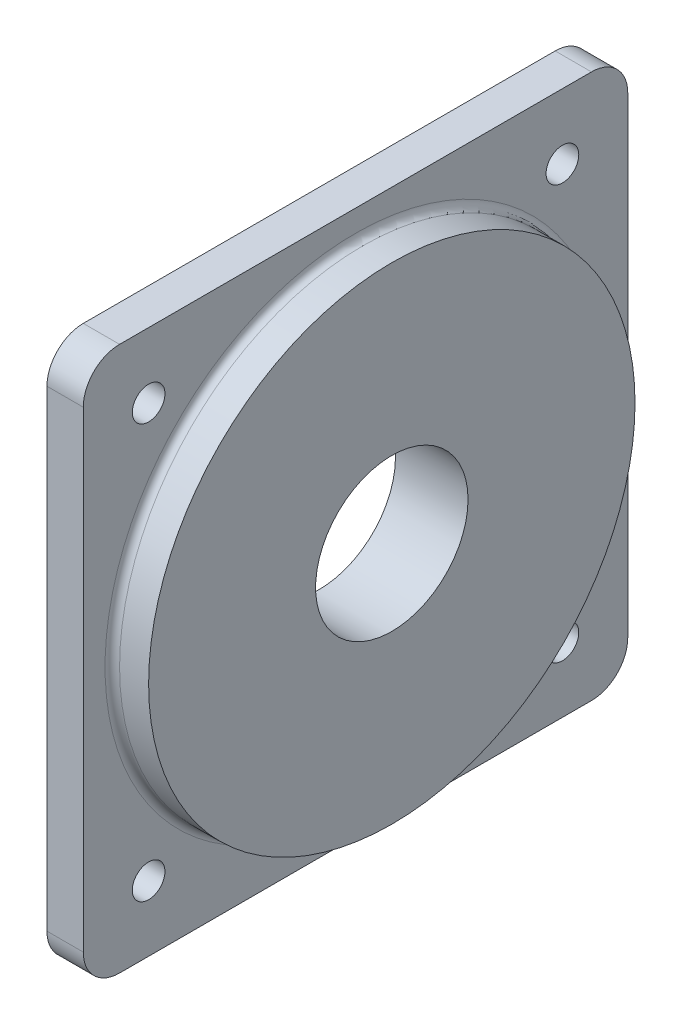
ISO-10303-21;
HEADER;
FILE_DESCRIPTION(('STEP AP214'),'2;1');
FILE_NAME('part.step','',(''),(''),'','','');
FILE_SCHEMA(('AUTOMOTIVE_DESIGN { 1 0 10303 214 1 1 1 1 }'));
ENDSEC;
DATA;
#1=APPLICATION_CONTEXT('core data for automotive mechanical design processes');
#2=APPLICATION_PROTOCOL_DEFINITION('international standard','automotive_design',2000,#1);
#3=PRODUCT_CONTEXT('',#1,'mechanical');
#4=PRODUCT('Part','Part','',(#3));
#5=PRODUCT_RELATED_PRODUCT_CATEGORY('part','',(#4));
#6=PRODUCT_DEFINITION_FORMATION('','',#4);
#7=PRODUCT_DEFINITION_CONTEXT('part definition',#1,'design');
#8=PRODUCT_DEFINITION('design','',#6,#7);
#9=PRODUCT_DEFINITION_SHAPE('','',#8);
#10=(LENGTH_UNIT() NAMED_UNIT(*) SI_UNIT(.MILLI.,.METRE.));
#11=(NAMED_UNIT(*) PLANE_ANGLE_UNIT() SI_UNIT($,.RADIAN.));
#12=(NAMED_UNIT(*) SI_UNIT($,.STERADIAN.) SOLID_ANGLE_UNIT());
#13=UNCERTAINTY_MEASURE_WITH_UNIT(LENGTH_MEASURE(1.E-05),#10,'distance_accuracy_value','');
#14=(GEOMETRIC_REPRESENTATION_CONTEXT(3) GLOBAL_UNCERTAINTY_ASSIGNED_CONTEXT((#13)) GLOBAL_UNIT_ASSIGNED_CONTEXT((#10,
#11,#12)) REPRESENTATION_CONTEXT('',''));
#15=CARTESIAN_POINT('',(0.,0.,0.));
#16=DIRECTION('',(0.,0.,1.));
#17=DIRECTION('',(1.,0.,0.));
#18=AXIS2_PLACEMENT_3D('',#15,#16,#17);
#19=CARTESIAN_POINT('',(10.,75.,-75.));
#20=DIRECTION('',(0.,0.,1.));
#21=DIRECTION('',(1.,0.,0.));
#22=AXIS2_PLACEMENT_3D('',#19,#20,#21);
#23=PLANE('',#22);
#24=DIRECTION('',(0.,1.,0.));
#25=VECTOR('',#24,1.);
#26=CARTESIAN_POINT('',(10.,75.,-75.));
#27=LINE('',#26,#25);
#28=CARTESIAN_POINT('',(10.,-65.,-75.));
#29=VERTEX_POINT('',#28);
#30=CARTESIAN_POINT('',(10.,65.,-75.));
#31=VERTEX_POINT('',#30);
#32=EDGE_CURVE('E132',#29,#31,#27,.T.);
#33=ORIENTED_EDGE('',*,*,#32,.F.);
#34=DIRECTION('',(-1.,0.,0.));
#35=VECTOR('',#34,1.);
#36=CARTESIAN_POINT('',(10.,-65.,-75.));
#37=LINE('',#36,#35);
#38=CARTESIAN_POINT('',(0.,-65.,-75.));
#39=VERTEX_POINT('',#38);
#40=EDGE_CURVE('E158',#29,#39,#37,.T.);
#41=ORIENTED_EDGE('',*,*,#40,.T.);
#42=DIRECTION('',(0.,1.,0.));
#43=VECTOR('',#42,1.);
#44=CARTESIAN_POINT('',(0.,75.,-75.));
#45=LINE('',#44,#43);
#46=CARTESIAN_POINT('',(0.,65.,-75.));
#47=VERTEX_POINT('',#46);
#48=EDGE_CURVE('E211',#39,#47,#45,.T.);
#49=ORIENTED_EDGE('',*,*,#48,.T.);
#50=DIRECTION('',(-1.,0.,0.));
#51=VECTOR('',#50,1.);
#52=CARTESIAN_POINT('',(10.,65.,-75.));
#53=LINE('',#52,#51);
#54=EDGE_CURVE('E156',#47,#31,#53,.F.);
#55=ORIENTED_EDGE('',*,*,#54,.T.);
#56=EDGE_LOOP('',(#33,#41,#49,#55));
#57=FACE_BOUND('',#56,.T.);
#58=ADVANCED_FACE('F39',(#57),#23,.F.);
#59=CARTESIAN_POINT('',(10.,75.,75.));
#60=DIRECTION('',(0.,-1.,0.));
#61=DIRECTION('',(0.,0.,-1.));
#62=AXIS2_PLACEMENT_3D('',#59,#60,#61);
#63=PLANE('',#62);
#64=DIRECTION('',(0.,0.,1.));
#65=VECTOR('',#64,1.);
#66=CARTESIAN_POINT('',(10.,75.,75.));
#67=LINE('',#66,#65);
#68=CARTESIAN_POINT('',(10.,75.,-65.));
#69=VERTEX_POINT('',#68);
#70=CARTESIAN_POINT('',(10.,75.,65.));
#71=VERTEX_POINT('',#70);
#72=EDGE_CURVE('E135',#69,#71,#67,.T.);
#73=ORIENTED_EDGE('',*,*,#72,.F.);
#74=DIRECTION('',(-1.,0.,0.));
#75=VECTOR('',#74,1.);
#76=CARTESIAN_POINT('',(10.,75.,-65.));
#77=LINE('',#76,#75);
#78=CARTESIAN_POINT('',(0.,75.,-65.));
#79=VERTEX_POINT('',#78);
#80=EDGE_CURVE('E162',#69,#79,#77,.T.);
#81=ORIENTED_EDGE('',*,*,#80,.T.);
#82=DIRECTION('',(0.,0.,1.));
#83=VECTOR('',#82,1.);
#84=CARTESIAN_POINT('',(0.,75.,75.));
#85=LINE('',#84,#83);
#86=CARTESIAN_POINT('',(0.,75.,65.));
#87=VERTEX_POINT('',#86);
#88=EDGE_CURVE('E137',#79,#87,#85,.T.);
#89=ORIENTED_EDGE('',*,*,#88,.T.);
#90=DIRECTION('',(-1.,0.,0.));
#91=VECTOR('',#90,1.);
#92=CARTESIAN_POINT('',(10.,75.,65.));
#93=LINE('',#92,#91);
#94=EDGE_CURVE('E54',#87,#71,#93,.F.);
#95=ORIENTED_EDGE('',*,*,#94,.T.);
#96=EDGE_LOOP('',(#73,#81,#89,#95));
#97=FACE_BOUND('',#96,.T.);
#98=ADVANCED_FACE('F185',(#97),#63,.F.);
#99=CARTESIAN_POINT('',(10.,75.,75.));
#100=DIRECTION('',(0.,0.,-1.));
#101=DIRECTION('',(-1.,0.,0.));
#102=AXIS2_PLACEMENT_3D('',#99,#100,#101);
#103=PLANE('',#102);
#104=DIRECTION('',(0.,-1.,0.));
#105=VECTOR('',#104,1.);
#106=CARTESIAN_POINT('',(0.,75.,75.));
#107=LINE('',#106,#105);
#108=CARTESIAN_POINT('',(0.,65.,75.));
#109=VERTEX_POINT('',#108);
#110=CARTESIAN_POINT('',(0.,-65.,75.));
#111=VERTEX_POINT('',#110);
#112=EDGE_CURVE('E133',#109,#111,#107,.T.);
#113=ORIENTED_EDGE('',*,*,#112,.T.);
#114=DIRECTION('',(-1.,0.,0.));
#115=VECTOR('',#114,1.);
#116=CARTESIAN_POINT('',(10.,-65.,75.));
#117=LINE('',#116,#115);
#118=CARTESIAN_POINT('',(10.,-65.,75.));
#119=VERTEX_POINT('',#118);
#120=EDGE_CURVE('E111',#111,#119,#117,.F.);
#121=ORIENTED_EDGE('',*,*,#120,.T.);
#122=DIRECTION('',(0.,-1.,0.));
#123=VECTOR('',#122,1.);
#124=CARTESIAN_POINT('',(10.,75.,75.));
#125=LINE('',#124,#123);
#126=CARTESIAN_POINT('',(10.,65.,75.));
#127=VERTEX_POINT('',#126);
#128=EDGE_CURVE('E216',#127,#119,#125,.T.);
#129=ORIENTED_EDGE('',*,*,#128,.F.);
#130=DIRECTION('',(-1.,0.,0.));
#131=VECTOR('',#130,1.);
#132=CARTESIAN_POINT('',(10.,65.,75.));
#133=LINE('',#132,#131);
#134=EDGE_CURVE('E116',#127,#109,#133,.T.);
#135=ORIENTED_EDGE('',*,*,#134,.T.);
#136=EDGE_LOOP('',(#113,#121,#129,#135));
#137=FACE_BOUND('',#136,.T.);
#138=ADVANCED_FACE('F191',(#137),#103,.F.);
#139=CARTESIAN_POINT('',(10.,-75.,75.));
#140=DIRECTION('',(0.,1.,0.));
#141=DIRECTION('',(0.,0.,1.));
#142=AXIS2_PLACEMENT_3D('',#139,#140,#141);
#143=PLANE('',#142);
#144=DIRECTION('',(0.,0.,-1.));
#145=VECTOR('',#144,1.);
#146=CARTESIAN_POINT('',(10.,-75.,75.));
#147=LINE('',#146,#145);
#148=CARTESIAN_POINT('',(10.,-75.,65.));
#149=VERTEX_POINT('',#148);
#150=CARTESIAN_POINT('',(10.,-75.,-65.));
#151=VERTEX_POINT('',#150);
#152=EDGE_CURVE('E126',#149,#151,#147,.T.);
#153=ORIENTED_EDGE('',*,*,#152,.F.);
#154=DIRECTION('',(-1.,0.,0.));
#155=VECTOR('',#154,1.);
#156=CARTESIAN_POINT('',(10.,-75.,65.));
#157=LINE('',#156,#155);
#158=CARTESIAN_POINT('',(0.,-75.,65.));
#159=VERTEX_POINT('',#158);
#160=EDGE_CURVE('E110',#149,#159,#157,.T.);
#161=ORIENTED_EDGE('',*,*,#160,.T.);
#162=DIRECTION('',(0.,0.,-1.));
#163=VECTOR('',#162,1.);
#164=CARTESIAN_POINT('',(0.,-75.,75.));
#165=LINE('',#164,#163);
#166=CARTESIAN_POINT('',(0.,-75.,-65.));
#167=VERTEX_POINT('',#166);
#168=EDGE_CURVE('E123',#159,#167,#165,.T.);
#169=ORIENTED_EDGE('',*,*,#168,.T.);
#170=DIRECTION('',(-1.,0.,0.));
#171=VECTOR('',#170,1.);
#172=CARTESIAN_POINT('',(10.,-75.,-65.));
#173=LINE('',#172,#171);
#174=EDGE_CURVE('E128',#167,#151,#173,.F.);
#175=ORIENTED_EDGE('',*,*,#174,.T.);
#176=EDGE_LOOP('',(#153,#161,#169,#175));
#177=FACE_BOUND('',#176,.T.);
#178=ADVANCED_FACE('F122',(#177),#143,.F.);
#179=CARTESIAN_POINT('',(10.,0.,0.));
#180=DIRECTION('',(1.,0.,0.));
#181=DIRECTION('',(0.,0.,-1.));
#182=AXIS2_PLACEMENT_3D('',#179,#180,#181);
#183=PLANE('',#182);
#184=CARTESIAN_POINT('',(10.,-57.,-57.));
#185=DIRECTION('',(1.,0.,0.));
#186=DIRECTION('',(0.,0.,-1.));
#187=AXIS2_PLACEMENT_3D('',#184,#185,#186);
#188=CIRCLE('',#187,4.49999999999999);
#189=CARTESIAN_POINT('',(10.,-57.,-61.5));
#190=VERTEX_POINT('',#189);
#191=EDGE_CURVE('E249',#190,#190,#188,.T.);
#192=ORIENTED_EDGE('',*,*,#191,.F.);
#193=EDGE_LOOP('',(#192));
#194=FACE_BOUND('',#193,.T.);
#195=CARTESIAN_POINT('',(10.,-57.,57.));
#196=DIRECTION('',(1.,0.,0.));
#197=DIRECTION('',(0.,0.,-1.));
#198=AXIS2_PLACEMENT_3D('',#195,#196,#197);
#199=CIRCLE('',#198,4.49999999999999);
#200=CARTESIAN_POINT('',(10.,-57.,52.5));
#201=VERTEX_POINT('',#200);
#202=EDGE_CURVE('E243',#201,#201,#199,.T.);
#203=ORIENTED_EDGE('',*,*,#202,.F.);
#204=EDGE_LOOP('',(#203));
#205=FACE_BOUND('',#204,.T.);
#206=CARTESIAN_POINT('',(10.,57.,57.));
#207=DIRECTION('',(1.,0.,0.));
#208=DIRECTION('',(0.,0.,-1.));
#209=AXIS2_PLACEMENT_3D('',#206,#207,#208);
#210=CIRCLE('',#209,4.49999999999999);
#211=CARTESIAN_POINT('',(10.,57.,52.5));
#212=VERTEX_POINT('',#211);
#213=EDGE_CURVE('E237',#212,#212,#210,.T.);
#214=ORIENTED_EDGE('',*,*,#213,.F.);
#215=EDGE_LOOP('',(#214));
#216=FACE_BOUND('',#215,.T.);
#217=CARTESIAN_POINT('',(10.,57.,-57.));
#218=DIRECTION('',(1.,0.,0.));
#219=DIRECTION('',(0.,0.,-1.));
#220=AXIS2_PLACEMENT_3D('',#217,#218,#219);
#221=CIRCLE('',#220,4.49999999999999);
#222=CARTESIAN_POINT('',(10.,57.,-61.5));
#223=VERTEX_POINT('',#222);
#224=EDGE_CURVE('E231',#223,#223,#221,.T.);
#225=ORIENTED_EDGE('',*,*,#224,.F.);
#226=EDGE_LOOP('',(#225));
#227=FACE_BOUND('',#226,.T.);
#228=CARTESIAN_POINT('',(10.,0.,0.));
#229=DIRECTION('',(1.,0.,0.));
#230=DIRECTION('',(0.,0.,-1.));
#231=AXIS2_PLACEMENT_3D('',#228,#229,#230);
#232=CIRCLE('',#231,69.);
#233=CARTESIAN_POINT('',(10.,0.,-69.));
#234=VERTEX_POINT('',#233);
#235=EDGE_CURVE('E11',#234,#234,#232,.F.);
#236=ORIENTED_EDGE('',*,*,#235,.T.);
#237=EDGE_LOOP('',(#236));
#238=FACE_BOUND('',#237,.T.);
#239=ORIENTED_EDGE('',*,*,#128,.T.);
#240=CARTESIAN_POINT('',(10.,-65.,65.));
#241=DIRECTION('',(1.,0.,0.));
#242=DIRECTION('',(0.,0.,-1.));
#243=AXIS2_PLACEMENT_3D('',#240,#241,#242);
#244=CIRCLE('',#243,10.);
#245=EDGE_CURVE('E154',#119,#149,#244,.T.);
#246=ORIENTED_EDGE('',*,*,#245,.T.);
#247=ORIENTED_EDGE('',*,*,#152,.T.);
#248=CARTESIAN_POINT('',(10.,-65.,-65.));
#249=DIRECTION('',(1.,0.,0.));
#250=DIRECTION('',(0.,0.,-1.));
#251=AXIS2_PLACEMENT_3D('',#248,#249,#250);
#252=CIRCLE('',#251,10.);
#253=EDGE_CURVE('E152',#151,#29,#252,.T.);
#254=ORIENTED_EDGE('',*,*,#253,.T.);
#255=ORIENTED_EDGE('',*,*,#32,.T.);
#256=CARTESIAN_POINT('',(10.,65.,-65.));
#257=DIRECTION('',(1.,0.,0.));
#258=DIRECTION('',(0.,0.,-1.));
#259=AXIS2_PLACEMENT_3D('',#256,#257,#258);
#260=CIRCLE('',#259,10.);
#261=EDGE_CURVE('E61',#31,#69,#260,.T.);
#262=ORIENTED_EDGE('',*,*,#261,.T.);
#263=ORIENTED_EDGE('',*,*,#72,.T.);
#264=CARTESIAN_POINT('',(10.,65.,65.));
#265=DIRECTION('',(1.,0.,0.));
#266=DIRECTION('',(0.,0.,-1.));
#267=AXIS2_PLACEMENT_3D('',#264,#265,#266);
#268=CIRCLE('',#267,10.);
#269=EDGE_CURVE('E149',#71,#127,#268,.T.);
#270=ORIENTED_EDGE('',*,*,#269,.T.);
#271=EDGE_LOOP('',(#239,#246,#247,#254,#255,#262,#263,#270));
#272=FACE_BOUND('',#271,.T.);
#273=ADVANCED_FACE('F255',(#194,#205,#216,#227,#238,#272),#183,.T.);
#274=CARTESIAN_POINT('',(0.,0.,0.));
#275=DIRECTION('',(1.,0.,0.));
#276=DIRECTION('',(0.,0.,-1.));
#277=AXIS2_PLACEMENT_3D('',#274,#275,#276);
#278=PLANE('',#277);
#279=CARTESIAN_POINT('',(0.,-57.,-57.));
#280=DIRECTION('',(1.,0.,0.));
#281=DIRECTION('',(0.,0.,-1.));
#282=AXIS2_PLACEMENT_3D('',#279,#280,#281);
#283=CIRCLE('',#282,4.49999999999999);
#284=CARTESIAN_POINT('',(0.,-57.,-61.5));
#285=VERTEX_POINT('',#284);
#286=EDGE_CURVE('E246',#285,#285,#283,.T.);
#287=ORIENTED_EDGE('',*,*,#286,.T.);
#288=EDGE_LOOP('',(#287));
#289=FACE_BOUND('',#288,.T.);
#290=CARTESIAN_POINT('',(0.,-57.,57.));
#291=DIRECTION('',(1.,0.,0.));
#292=DIRECTION('',(0.,0.,-1.));
#293=AXIS2_PLACEMENT_3D('',#290,#291,#292);
#294=CIRCLE('',#293,4.49999999999999);
#295=CARTESIAN_POINT('',(0.,-57.,52.5));
#296=VERTEX_POINT('',#295);
#297=EDGE_CURVE('E240',#296,#296,#294,.T.);
#298=ORIENTED_EDGE('',*,*,#297,.T.);
#299=EDGE_LOOP('',(#298));
#300=FACE_BOUND('',#299,.T.);
#301=CARTESIAN_POINT('',(0.,57.,57.));
#302=DIRECTION('',(1.,0.,0.));
#303=DIRECTION('',(0.,0.,-1.));
#304=AXIS2_PLACEMENT_3D('',#301,#302,#303);
#305=CIRCLE('',#304,4.49999999999999);
#306=CARTESIAN_POINT('',(0.,57.,52.5));
#307=VERTEX_POINT('',#306);
#308=EDGE_CURVE('E234',#307,#307,#305,.T.);
#309=ORIENTED_EDGE('',*,*,#308,.T.);
#310=EDGE_LOOP('',(#309));
#311=FACE_BOUND('',#310,.T.);
#312=CARTESIAN_POINT('',(0.,57.,-57.));
#313=DIRECTION('',(1.,0.,0.));
#314=DIRECTION('',(0.,0.,-1.));
#315=AXIS2_PLACEMENT_3D('',#312,#313,#314);
#316=CIRCLE('',#315,4.49999999999999);
#317=CARTESIAN_POINT('',(0.,57.,-61.5));
#318=VERTEX_POINT('',#317);
#319=EDGE_CURVE('E226',#318,#318,#316,.T.);
#320=ORIENTED_EDGE('',*,*,#319,.T.);
#321=EDGE_LOOP('',(#320));
#322=FACE_BOUND('',#321,.T.);
#323=CARTESIAN_POINT('',(0.,0.,0.));
#324=DIRECTION('',(1.,0.,0.));
#325=DIRECTION('',(0.,0.,-1.));
#326=AXIS2_PLACEMENT_3D('',#323,#324,#325);
#327=CIRCLE('',#326,21.);
#328=CARTESIAN_POINT('',(0.,0.,-21.));
#329=VERTEX_POINT('',#328);
#330=EDGE_CURVE('E222',#329,#329,#327,.T.);
#331=ORIENTED_EDGE('',*,*,#330,.T.);
#332=EDGE_LOOP('',(#331));
#333=FACE_BOUND('',#332,.T.);
#334=ORIENTED_EDGE('',*,*,#168,.F.);
#335=CARTESIAN_POINT('',(0.,-65.,65.));
#336=DIRECTION('',(1.,0.,0.));
#337=DIRECTION('',(0.,0.,-1.));
#338=AXIS2_PLACEMENT_3D('',#335,#336,#337);
#339=CIRCLE('',#338,10.);
#340=EDGE_CURVE('E106',#159,#111,#339,.F.);
#341=ORIENTED_EDGE('',*,*,#340,.T.);
#342=ORIENTED_EDGE('',*,*,#112,.F.);
#343=CARTESIAN_POINT('',(0.,65.,65.));
#344=DIRECTION('',(1.,0.,0.));
#345=DIRECTION('',(0.,0.,-1.));
#346=AXIS2_PLACEMENT_3D('',#343,#344,#345);
#347=CIRCLE('',#346,10.);
#348=EDGE_CURVE('E127',#109,#87,#347,.F.);
#349=ORIENTED_EDGE('',*,*,#348,.T.);
#350=ORIENTED_EDGE('',*,*,#88,.F.);
#351=CARTESIAN_POINT('',(0.,65.,-65.));
#352=DIRECTION('',(1.,0.,0.));
#353=DIRECTION('',(0.,0.,-1.));
#354=AXIS2_PLACEMENT_3D('',#351,#352,#353);
#355=CIRCLE('',#354,10.);
#356=EDGE_CURVE('E143',#79,#47,#355,.F.);
#357=ORIENTED_EDGE('',*,*,#356,.T.);
#358=ORIENTED_EDGE('',*,*,#48,.F.);
#359=CARTESIAN_POINT('',(0.,-65.,-65.));
#360=DIRECTION('',(1.,0.,0.));
#361=DIRECTION('',(0.,0.,-1.));
#362=AXIS2_PLACEMENT_3D('',#359,#360,#361);
#363=CIRCLE('',#362,10.);
#364=EDGE_CURVE('E117',#39,#167,#363,.F.);
#365=ORIENTED_EDGE('',*,*,#364,.T.);
#366=EDGE_LOOP('',(#334,#341,#342,#349,#350,#357,#358,#365));
#367=FACE_BOUND('',#366,.T.);
#368=ADVANCED_FACE('F130',(#289,#300,#311,#322,#333,#367),#278,.F.);
#369=CARTESIAN_POINT('',(20.,0.,0.));
#370=DIRECTION('',(-1.,0.,0.));
#371=DIRECTION('',(0.,0.,1.));
#372=AXIS2_PLACEMENT_3D('',#369,#370,#371);
#373=CYLINDRICAL_SURFACE('',#372,67.);
#374=CARTESIAN_POINT('',(12.,0.,0.));
#375=DIRECTION('',(1.,0.,0.));
#376=DIRECTION('',(0.,0.,-1.));
#377=AXIS2_PLACEMENT_3D('',#374,#375,#376);
#378=CIRCLE('',#377,67.);
#379=CARTESIAN_POINT('',(12.,0.,-67.));
#380=VERTEX_POINT('',#379);
#381=EDGE_CURVE('E47',#380,#380,#378,.T.);
#382=ORIENTED_EDGE('',*,*,#381,.T.);
#383=EDGE_LOOP('',(#382));
#384=FACE_BOUND('',#383,.T.);
#385=CARTESIAN_POINT('',(20.,0.,0.));
#386=DIRECTION('',(1.,0.,0.));
#387=DIRECTION('',(0.,0.,-1.));
#388=AXIS2_PLACEMENT_3D('',#385,#386,#387);
#389=CIRCLE('',#388,67.);
#390=CARTESIAN_POINT('',(20.,0.,-67.));
#391=VERTEX_POINT('',#390);
#392=EDGE_CURVE('E212',#391,#391,#389,.T.);
#393=ORIENTED_EDGE('',*,*,#392,.F.);
#394=EDGE_LOOP('',(#393));
#395=FACE_BOUND('',#394,.T.);
#396=ADVANCED_FACE('F167',(#384,#395),#373,.T.);
#397=CARTESIAN_POINT('',(20.,0.,0.));
#398=DIRECTION('',(1.,0.,0.));
#399=DIRECTION('',(0.,0.,-1.));
#400=AXIS2_PLACEMENT_3D('',#397,#398,#399);
#401=PLANE('',#400);
#402=CARTESIAN_POINT('',(20.,0.,0.));
#403=DIRECTION('',(1.,0.,0.));
#404=DIRECTION('',(0.,0.,-1.));
#405=AXIS2_PLACEMENT_3D('',#402,#403,#404);
#406=CIRCLE('',#405,21.);
#407=CARTESIAN_POINT('',(20.,0.,-21.));
#408=VERTEX_POINT('',#407);
#409=EDGE_CURVE('E223',#408,#408,#406,.T.);
#410=ORIENTED_EDGE('',*,*,#409,.F.);
#411=EDGE_LOOP('',(#410));
#412=FACE_BOUND('',#411,.T.);
#413=ORIENTED_EDGE('',*,*,#392,.T.);
#414=EDGE_LOOP('',(#413));
#415=FACE_BOUND('',#414,.T.);
#416=ADVANCED_FACE('F199',(#412,#415),#401,.T.);
#417=CARTESIAN_POINT('',(10.,-65.,65.));
#418=DIRECTION('',(-1.,0.,0.));
#419=DIRECTION('',(0.,0.,1.));
#420=AXIS2_PLACEMENT_3D('',#417,#418,#419);
#421=CYLINDRICAL_SURFACE('',#420,10.);
#422=ORIENTED_EDGE('',*,*,#245,.F.);
#423=ORIENTED_EDGE('',*,*,#120,.F.);
#424=ORIENTED_EDGE('',*,*,#340,.F.);
#425=ORIENTED_EDGE('',*,*,#160,.F.);
#426=EDGE_LOOP('',(#422,#423,#424,#425));
#427=FACE_BOUND('',#426,.T.);
#428=ADVANCED_FACE('F109',(#427),#421,.T.);
#429=CARTESIAN_POINT('',(10.,-65.,-65.));
#430=DIRECTION('',(-1.,0.,0.));
#431=DIRECTION('',(0.,0.,1.));
#432=AXIS2_PLACEMENT_3D('',#429,#430,#431);
#433=CYLINDRICAL_SURFACE('',#432,10.);
#434=ORIENTED_EDGE('',*,*,#253,.F.);
#435=ORIENTED_EDGE('',*,*,#174,.F.);
#436=ORIENTED_EDGE('',*,*,#364,.F.);
#437=ORIENTED_EDGE('',*,*,#40,.F.);
#438=EDGE_LOOP('',(#434,#435,#436,#437));
#439=FACE_BOUND('',#438,.T.);
#440=ADVANCED_FACE('F198',(#439),#433,.T.);
#441=CARTESIAN_POINT('',(10.,65.,-65.));
#442=DIRECTION('',(-1.,0.,0.));
#443=DIRECTION('',(0.,0.,1.));
#444=AXIS2_PLACEMENT_3D('',#441,#442,#443);
#445=CYLINDRICAL_SURFACE('',#444,10.);
#446=ORIENTED_EDGE('',*,*,#261,.F.);
#447=ORIENTED_EDGE('',*,*,#54,.F.);
#448=ORIENTED_EDGE('',*,*,#356,.F.);
#449=ORIENTED_EDGE('',*,*,#80,.F.);
#450=EDGE_LOOP('',(#446,#447,#448,#449));
#451=FACE_BOUND('',#450,.T.);
#452=ADVANCED_FACE('F181',(#451),#445,.T.);
#453=CARTESIAN_POINT('',(10.,65.,65.));
#454=DIRECTION('',(-1.,0.,0.));
#455=DIRECTION('',(0.,0.,1.));
#456=AXIS2_PLACEMENT_3D('',#453,#454,#455);
#457=CYLINDRICAL_SURFACE('',#456,10.);
#458=ORIENTED_EDGE('',*,*,#269,.F.);
#459=ORIENTED_EDGE('',*,*,#94,.F.);
#460=ORIENTED_EDGE('',*,*,#348,.F.);
#461=ORIENTED_EDGE('',*,*,#134,.F.);
#462=EDGE_LOOP('',(#458,#459,#460,#461));
#463=FACE_BOUND('',#462,.T.);
#464=ADVANCED_FACE('F172',(#463),#457,.T.);
#465=CARTESIAN_POINT('',(12.,0.,0.));
#466=DIRECTION('',(1.,0.,0.));
#467=DIRECTION('',(0.,0.,-1.));
#468=AXIS2_PLACEMENT_3D('',#465,#466,#467);
#469=TOROIDAL_SURFACE('',#468,69.,2.);
#470=ORIENTED_EDGE('',*,*,#235,.F.);
#471=EDGE_LOOP('',(#470));
#472=FACE_BOUND('',#471,.T.);
#473=ORIENTED_EDGE('',*,*,#381,.F.);
#474=EDGE_LOOP('',(#473));
#475=FACE_BOUND('',#474,.T.);
#476=ADVANCED_FACE('F41',(#472,#475),#469,.F.);
#477=CARTESIAN_POINT('',(0.,0.,0.));
#478=DIRECTION('',(1.,0.,0.));
#479=DIRECTION('',(0.,0.,-1.));
#480=AXIS2_PLACEMENT_3D('',#477,#478,#479);
#481=CYLINDRICAL_SURFACE('',#480,21.);
#482=ORIENTED_EDGE('',*,*,#330,.F.);
#483=EDGE_LOOP('',(#482));
#484=FACE_BOUND('',#483,.T.);
#485=ORIENTED_EDGE('',*,*,#409,.T.);
#486=EDGE_LOOP('',(#485));
#487=FACE_BOUND('',#486,.T.);
#488=ADVANCED_FACE('F171',(#484,#487),#481,.F.);
#489=CARTESIAN_POINT('',(10.,57.,-57.));
#490=DIRECTION('',(1.,0.,0.));
#491=DIRECTION('',(0.,0.,-1.));
#492=AXIS2_PLACEMENT_3D('',#489,#490,#491);
#493=CYLINDRICAL_SURFACE('',#492,4.49999999999999);
#494=ORIENTED_EDGE('',*,*,#319,.F.);
#495=EDGE_LOOP('',(#494));
#496=FACE_BOUND('',#495,.T.);
#497=ORIENTED_EDGE('',*,*,#224,.T.);
#498=EDGE_LOOP('',(#497));
#499=FACE_BOUND('',#498,.T.);
#500=ADVANCED_FACE('F178',(#496,#499),#493,.F.);
#501=CARTESIAN_POINT('',(10.,57.,57.));
#502=DIRECTION('',(1.,0.,0.));
#503=DIRECTION('',(0.,0.,-1.));
#504=AXIS2_PLACEMENT_3D('',#501,#502,#503);
#505=CYLINDRICAL_SURFACE('',#504,4.49999999999999);
#506=ORIENTED_EDGE('',*,*,#308,.F.);
#507=EDGE_LOOP('',(#506));
#508=FACE_BOUND('',#507,.T.);
#509=ORIENTED_EDGE('',*,*,#213,.T.);
#510=EDGE_LOOP('',(#509));
#511=FACE_BOUND('',#510,.T.);
#512=ADVANCED_FACE('F285',(#508,#511),#505,.F.);
#513=CARTESIAN_POINT('',(10.,-57.,57.));
#514=DIRECTION('',(1.,0.,0.));
#515=DIRECTION('',(0.,0.,-1.));
#516=AXIS2_PLACEMENT_3D('',#513,#514,#515);
#517=CYLINDRICAL_SURFACE('',#516,4.49999999999999);
#518=ORIENTED_EDGE('',*,*,#297,.F.);
#519=EDGE_LOOP('',(#518));
#520=FACE_BOUND('',#519,.T.);
#521=ORIENTED_EDGE('',*,*,#202,.T.);
#522=EDGE_LOOP('',(#521));
#523=FACE_BOUND('',#522,.T.);
#524=ADVANCED_FACE('F289',(#520,#523),#517,.F.);
#525=CARTESIAN_POINT('',(10.,-57.,-57.));
#526=DIRECTION('',(1.,0.,0.));
#527=DIRECTION('',(0.,0.,-1.));
#528=AXIS2_PLACEMENT_3D('',#525,#526,#527);
#529=CYLINDRICAL_SURFACE('',#528,4.49999999999999);
#530=ORIENTED_EDGE('',*,*,#286,.F.);
#531=EDGE_LOOP('',(#530));
#532=FACE_BOUND('',#531,.T.);
#533=ORIENTED_EDGE('',*,*,#191,.T.);
#534=EDGE_LOOP('',(#533));
#535=FACE_BOUND('',#534,.T.);
#536=ADVANCED_FACE('F253',(#532,#535),#529,.F.);
#537=CLOSED_SHELL('',(#58,#98,#138,#178,#273,#368,#396,#416,#428,#440,#452,#464,#476,#488,#500,
#512,#524,#536));
#538=MANIFOLD_SOLID_BREP('B2',#537);
#539=ADVANCED_BREP_SHAPE_REPRESENTATION('',(#18,#538),#14);
#540=SHAPE_DEFINITION_REPRESENTATION(#9,#539);
ENDSEC;
END-ISO-10303-21;
